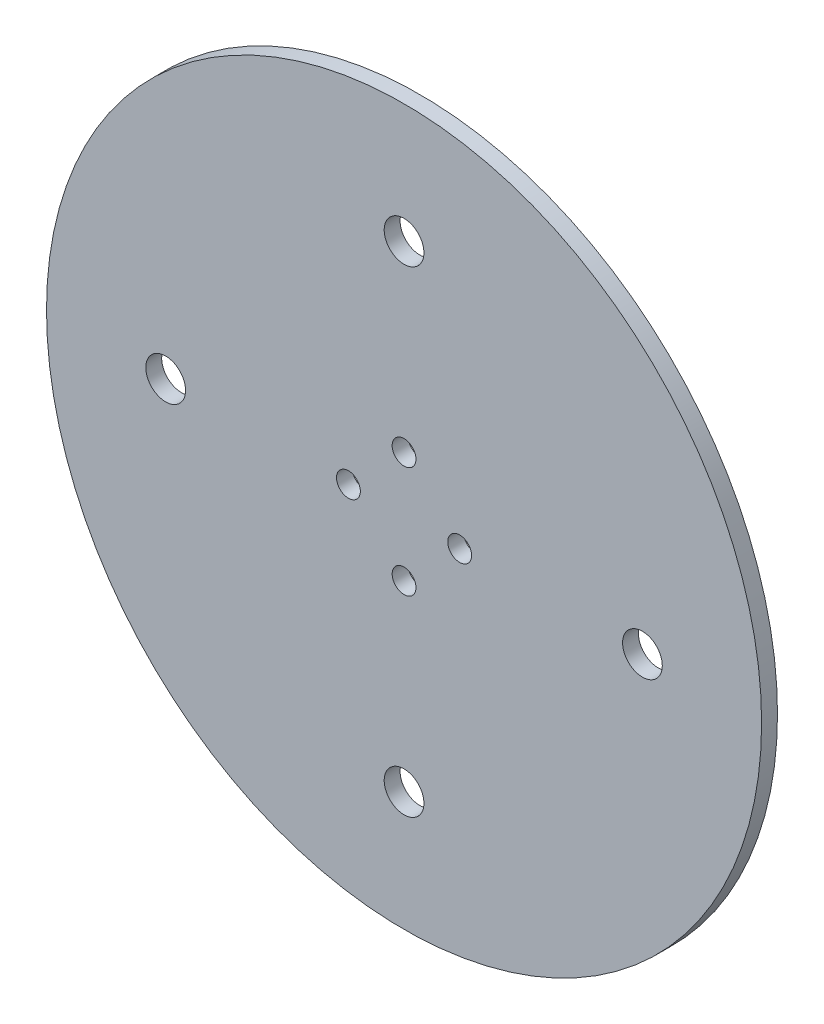
ISO-10303-21;
HEADER;
FILE_DESCRIPTION(('STEP AP214'),'2;1');
FILE_NAME('part.step','',(''),(''),'','','');
FILE_SCHEMA(('AUTOMOTIVE_DESIGN { 1 0 10303 214 1 1 1 1 }'));
ENDSEC;
DATA;
#1=APPLICATION_CONTEXT('core data for automotive mechanical design processes');
#2=APPLICATION_PROTOCOL_DEFINITION('international standard','automotive_design',2000,#1);
#3=PRODUCT_CONTEXT('',#1,'mechanical');
#4=PRODUCT('Part','Part','',(#3));
#5=PRODUCT_RELATED_PRODUCT_CATEGORY('part','',(#4));
#6=PRODUCT_DEFINITION_FORMATION('','',#4);
#7=PRODUCT_DEFINITION_CONTEXT('part definition',#1,'design');
#8=PRODUCT_DEFINITION('design','',#6,#7);
#9=PRODUCT_DEFINITION_SHAPE('','',#8);
#10=(LENGTH_UNIT() NAMED_UNIT(*) SI_UNIT(.MILLI.,.METRE.));
#11=(NAMED_UNIT(*) PLANE_ANGLE_UNIT() SI_UNIT($,.RADIAN.));
#12=(NAMED_UNIT(*) SI_UNIT($,.STERADIAN.) SOLID_ANGLE_UNIT());
#13=UNCERTAINTY_MEASURE_WITH_UNIT(LENGTH_MEASURE(1.E-05),#10,'distance_accuracy_value','');
#14=(GEOMETRIC_REPRESENTATION_CONTEXT(3) GLOBAL_UNCERTAINTY_ASSIGNED_CONTEXT((#13)) GLOBAL_UNIT_ASSIGNED_CONTEXT((#10,
#11,#12)) REPRESENTATION_CONTEXT('',''));
#15=CARTESIAN_POINT('',(0.,0.,0.));
#16=DIRECTION('',(0.,0.,1.));
#17=DIRECTION('',(1.,0.,0.));
#18=AXIS2_PLACEMENT_3D('',#15,#16,#17);
#19=CARTESIAN_POINT('',(0.,0.,2.));
#20=DIRECTION('',(0.,0.,1.));
#21=DIRECTION('',(1.,0.,0.));
#22=AXIS2_PLACEMENT_3D('',#19,#20,#21);
#23=PLANE('',#22);
#24=CARTESIAN_POINT('',(1.69795468502936E-12,-30.,2.));
#25=DIRECTION('',(0.,0.,1.));
#26=DIRECTION('',(1.,0.,0.));
#27=AXIS2_PLACEMENT_3D('',#24,#25,#26);
#28=CIRCLE('',#27,2.50000000000182);
#29=CARTESIAN_POINT('',(2.50000000000352,-30.,2.));
#30=VERTEX_POINT('',#29);
#31=EDGE_CURVE('E76',#30,#30,#28,.T.);
#32=ORIENTED_EDGE('',*,*,#31,.F.);
#33=EDGE_LOOP('',(#32));
#34=FACE_BOUND('',#33,.T.);
#35=CARTESIAN_POINT('',(-7.,0.,2.));
#36=DIRECTION('',(0.,0.,1.));
#37=DIRECTION('',(1.,0.,0.));
#38=AXIS2_PLACEMENT_3D('',#35,#36,#37);
#39=CIRCLE('',#38,1.5);
#40=CARTESIAN_POINT('',(-5.5,0.,2.));
#41=VERTEX_POINT('',#40);
#42=EDGE_CURVE('E64',#41,#41,#39,.T.);
#43=ORIENTED_EDGE('',*,*,#42,.F.);
#44=EDGE_LOOP('',(#43));
#45=FACE_BOUND('',#44,.T.);
#46=CARTESIAN_POINT('',(7.,0.,2.));
#47=DIRECTION('',(0.,0.,1.));
#48=DIRECTION('',(1.,0.,0.));
#49=AXIS2_PLACEMENT_3D('',#46,#47,#48);
#50=CIRCLE('',#49,1.5);
#51=CARTESIAN_POINT('',(8.5,0.,2.));
#52=VERTEX_POINT('',#51);
#53=EDGE_CURVE('E52',#52,#52,#50,.T.);
#54=ORIENTED_EDGE('',*,*,#53,.F.);
#55=EDGE_LOOP('',(#54));
#56=FACE_BOUND('',#55,.T.);
#57=CARTESIAN_POINT('',(0.,7.,2.));
#58=DIRECTION('',(0.,0.,1.));
#59=DIRECTION('',(1.,0.,0.));
#60=AXIS2_PLACEMENT_3D('',#57,#58,#59);
#61=CIRCLE('',#60,1.5);
#62=CARTESIAN_POINT('',(1.5,7.,2.));
#63=VERTEX_POINT('',#62);
#64=EDGE_CURVE('E41',#63,#63,#61,.T.);
#65=ORIENTED_EDGE('',*,*,#64,.F.);
#66=EDGE_LOOP('',(#65));
#67=FACE_BOUND('',#66,.T.);
#68=CARTESIAN_POINT('',(0.,0.,2.));
#69=DIRECTION('',(0.,0.,1.));
#70=DIRECTION('',(1.,0.,0.));
#71=AXIS2_PLACEMENT_3D('',#68,#69,#70);
#72=CIRCLE('',#71,45.);
#73=CARTESIAN_POINT('',(45.,0.,2.));
#74=VERTEX_POINT('',#73);
#75=EDGE_CURVE('E10',#74,#74,#72,.T.);
#76=ORIENTED_EDGE('',*,*,#75,.T.);
#77=EDGE_LOOP('',(#76));
#78=FACE_BOUND('',#77,.T.);
#79=CARTESIAN_POINT('',(0.,30.,2.));
#80=DIRECTION('',(0.,0.,1.));
#81=DIRECTION('',(1.,0.,0.));
#82=AXIS2_PLACEMENT_3D('',#79,#80,#81);
#83=CIRCLE('',#82,2.5);
#84=CARTESIAN_POINT('',(2.5,30.,2.));
#85=VERTEX_POINT('',#84);
#86=EDGE_CURVE('E46',#85,#85,#83,.T.);
#87=ORIENTED_EDGE('',*,*,#86,.F.);
#88=EDGE_LOOP('',(#87));
#89=FACE_BOUND('',#88,.T.);
#90=CARTESIAN_POINT('',(0.,-7.,2.));
#91=DIRECTION('',(0.,0.,1.));
#92=DIRECTION('',(1.,0.,0.));
#93=AXIS2_PLACEMENT_3D('',#90,#91,#92);
#94=CIRCLE('',#93,1.5);
#95=CARTESIAN_POINT('',(1.49999999999995,-7.,2.));
#96=VERTEX_POINT('',#95);
#97=EDGE_CURVE('E58',#96,#96,#94,.T.);
#98=ORIENTED_EDGE('',*,*,#97,.F.);
#99=EDGE_LOOP('',(#98));
#100=FACE_BOUND('',#99,.T.);
#101=CARTESIAN_POINT('',(30.0000000000008,8.48977342514678E-13,2.));
#102=DIRECTION('',(0.,0.,1.));
#103=DIRECTION('',(1.,0.,0.));
#104=AXIS2_PLACEMENT_3D('',#101,#102,#103);
#105=CIRCLE('',#104,2.50000000000066);
#106=CARTESIAN_POINT('',(32.5000000000015,8.48977342514678E-13,2.));
#107=VERTEX_POINT('',#106);
#108=EDGE_CURVE('E70',#107,#107,#105,.T.);
#109=ORIENTED_EDGE('',*,*,#108,.F.);
#110=EDGE_LOOP('',(#109));
#111=FACE_BOUND('',#110,.T.);
#112=CARTESIAN_POINT('',(-29.9999999999992,-8.5265128291212E-13,2.));
#113=DIRECTION('',(0.,0.,1.));
#114=DIRECTION('',(1.,0.,0.));
#115=AXIS2_PLACEMENT_3D('',#112,#113,#114);
#116=CIRCLE('',#115,2.50000000000136);
#117=CARTESIAN_POINT('',(-27.4999999999978,-8.5265128291212E-13,2.));
#118=VERTEX_POINT('',#117);
#119=EDGE_CURVE('E82',#118,#118,#116,.T.);
#120=ORIENTED_EDGE('',*,*,#119,.F.);
#121=EDGE_LOOP('',(#120));
#122=FACE_BOUND('',#121,.T.);
#123=ADVANCED_FACE('F30',(#34,#45,#56,#67,#78,#89,#100,#111,#122),#23,.T.);
#124=CARTESIAN_POINT('',(0.,0.,0.));
#125=DIRECTION('',(0.,0.,1.));
#126=DIRECTION('',(1.,0.,0.));
#127=AXIS2_PLACEMENT_3D('',#124,#125,#126);
#128=PLANE('',#127);
#129=CARTESIAN_POINT('',(0.,0.,0.));
#130=DIRECTION('',(0.,0.,1.));
#131=DIRECTION('',(1.,0.,0.));
#132=AXIS2_PLACEMENT_3D('',#129,#130,#131);
#133=CIRCLE('',#132,45.);
#134=CARTESIAN_POINT('',(45.,0.,0.));
#135=VERTEX_POINT('',#134);
#136=EDGE_CURVE('E34',#135,#135,#133,.T.);
#137=ORIENTED_EDGE('',*,*,#136,.F.);
#138=EDGE_LOOP('',(#137));
#139=FACE_BOUND('',#138,.T.);
#140=CARTESIAN_POINT('',(0.,7.,0.));
#141=DIRECTION('',(0.,0.,1.));
#142=DIRECTION('',(1.,0.,0.));
#143=AXIS2_PLACEMENT_3D('',#140,#141,#142);
#144=CIRCLE('',#143,1.5);
#145=CARTESIAN_POINT('',(1.5,7.,0.));
#146=VERTEX_POINT('',#145);
#147=EDGE_CURVE('E43',#146,#146,#144,.T.);
#148=ORIENTED_EDGE('',*,*,#147,.T.);
#149=EDGE_LOOP('',(#148));
#150=FACE_BOUND('',#149,.T.);
#151=CARTESIAN_POINT('',(0.,30.,0.));
#152=DIRECTION('',(0.,0.,1.));
#153=DIRECTION('',(1.,0.,0.));
#154=AXIS2_PLACEMENT_3D('',#151,#152,#153);
#155=CIRCLE('',#154,2.5);
#156=CARTESIAN_POINT('',(2.5,30.,0.));
#157=VERTEX_POINT('',#156);
#158=EDGE_CURVE('E49',#157,#157,#155,.T.);
#159=ORIENTED_EDGE('',*,*,#158,.T.);
#160=EDGE_LOOP('',(#159));
#161=FACE_BOUND('',#160,.T.);
#162=CARTESIAN_POINT('',(7.,0.,0.));
#163=DIRECTION('',(0.,0.,1.));
#164=DIRECTION('',(1.,0.,0.));
#165=AXIS2_PLACEMENT_3D('',#162,#163,#164);
#166=CIRCLE('',#165,1.5);
#167=CARTESIAN_POINT('',(8.5,0.,0.));
#168=VERTEX_POINT('',#167);
#169=EDGE_CURVE('E55',#168,#168,#166,.T.);
#170=ORIENTED_EDGE('',*,*,#169,.T.);
#171=EDGE_LOOP('',(#170));
#172=FACE_BOUND('',#171,.T.);
#173=CARTESIAN_POINT('',(0.,-7.,0.));
#174=DIRECTION('',(0.,0.,1.));
#175=DIRECTION('',(1.,0.,0.));
#176=AXIS2_PLACEMENT_3D('',#173,#174,#175);
#177=CIRCLE('',#176,1.5);
#178=CARTESIAN_POINT('',(1.49999999999995,-7.,0.));
#179=VERTEX_POINT('',#178);
#180=EDGE_CURVE('E61',#179,#179,#177,.T.);
#181=ORIENTED_EDGE('',*,*,#180,.T.);
#182=EDGE_LOOP('',(#181));
#183=FACE_BOUND('',#182,.T.);
#184=CARTESIAN_POINT('',(-7.,0.,0.));
#185=DIRECTION('',(0.,0.,1.));
#186=DIRECTION('',(1.,0.,0.));
#187=AXIS2_PLACEMENT_3D('',#184,#185,#186);
#188=CIRCLE('',#187,1.5);
#189=CARTESIAN_POINT('',(-5.5,0.,0.));
#190=VERTEX_POINT('',#189);
#191=EDGE_CURVE('E67',#190,#190,#188,.T.);
#192=ORIENTED_EDGE('',*,*,#191,.T.);
#193=EDGE_LOOP('',(#192));
#194=FACE_BOUND('',#193,.T.);
#195=CARTESIAN_POINT('',(30.0000000000008,8.48977342514678E-13,0.));
#196=DIRECTION('',(0.,0.,1.));
#197=DIRECTION('',(1.,0.,0.));
#198=AXIS2_PLACEMENT_3D('',#195,#196,#197);
#199=CIRCLE('',#198,2.50000000000066);
#200=CARTESIAN_POINT('',(32.5000000000015,8.48977342514678E-13,0.));
#201=VERTEX_POINT('',#200);
#202=EDGE_CURVE('E73',#201,#201,#199,.T.);
#203=ORIENTED_EDGE('',*,*,#202,.T.);
#204=EDGE_LOOP('',(#203));
#205=FACE_BOUND('',#204,.T.);
#206=CARTESIAN_POINT('',(1.69795468502936E-12,-30.,0.));
#207=DIRECTION('',(0.,0.,1.));
#208=DIRECTION('',(1.,0.,0.));
#209=AXIS2_PLACEMENT_3D('',#206,#207,#208);
#210=CIRCLE('',#209,2.50000000000182);
#211=CARTESIAN_POINT('',(2.50000000000352,-30.,0.));
#212=VERTEX_POINT('',#211);
#213=EDGE_CURVE('E79',#212,#212,#210,.T.);
#214=ORIENTED_EDGE('',*,*,#213,.T.);
#215=EDGE_LOOP('',(#214));
#216=FACE_BOUND('',#215,.T.);
#217=CARTESIAN_POINT('',(-29.9999999999992,-8.5265128291212E-13,0.));
#218=DIRECTION('',(0.,0.,1.));
#219=DIRECTION('',(1.,0.,0.));
#220=AXIS2_PLACEMENT_3D('',#217,#218,#219);
#221=CIRCLE('',#220,2.50000000000136);
#222=CARTESIAN_POINT('',(-27.4999999999978,-8.5265128291212E-13,0.));
#223=VERTEX_POINT('',#222);
#224=EDGE_CURVE('E85',#223,#223,#221,.T.);
#225=ORIENTED_EDGE('',*,*,#224,.T.);
#226=EDGE_LOOP('',(#225));
#227=FACE_BOUND('',#226,.T.);
#228=ADVANCED_FACE('F95',(#139,#150,#161,#172,#183,#194,#205,#216,#227),#128,.F.);
#229=CARTESIAN_POINT('',(0.,0.,2.));
#230=DIRECTION('',(0.,0.,-1.));
#231=DIRECTION('',(-1.,0.,0.));
#232=AXIS2_PLACEMENT_3D('',#229,#230,#231);
#233=CYLINDRICAL_SURFACE('',#232,45.);
#234=ORIENTED_EDGE('',*,*,#75,.F.);
#235=EDGE_LOOP('',(#234));
#236=FACE_BOUND('',#235,.T.);
#237=ORIENTED_EDGE('',*,*,#136,.T.);
#238=EDGE_LOOP('',(#237));
#239=FACE_BOUND('',#238,.T.);
#240=ADVANCED_FACE('F32',(#236,#239),#233,.T.);
#241=CARTESIAN_POINT('',(0.,7.,2.));
#242=DIRECTION('',(0.,0.,-1.));
#243=DIRECTION('',(-1.,0.,0.));
#244=AXIS2_PLACEMENT_3D('',#241,#242,#243);
#245=CYLINDRICAL_SURFACE('',#244,1.5);
#246=ORIENTED_EDGE('',*,*,#64,.T.);
#247=EDGE_LOOP('',(#246));
#248=FACE_BOUND('',#247,.T.);
#249=ORIENTED_EDGE('',*,*,#147,.F.);
#250=EDGE_LOOP('',(#249));
#251=FACE_BOUND('',#250,.T.);
#252=ADVANCED_FACE('F105',(#248,#251),#245,.F.);
#253=CARTESIAN_POINT('',(0.,30.,2.));
#254=DIRECTION('',(0.,0.,-1.));
#255=DIRECTION('',(-1.,0.,0.));
#256=AXIS2_PLACEMENT_3D('',#253,#254,#255);
#257=CYLINDRICAL_SURFACE('',#256,2.5);
#258=ORIENTED_EDGE('',*,*,#86,.T.);
#259=EDGE_LOOP('',(#258));
#260=FACE_BOUND('',#259,.T.);
#261=ORIENTED_EDGE('',*,*,#158,.F.);
#262=EDGE_LOOP('',(#261));
#263=FACE_BOUND('',#262,.T.);
#264=ADVANCED_FACE('F108',(#260,#263),#257,.F.);
#265=CARTESIAN_POINT('',(7.,0.,2.));
#266=DIRECTION('',(0.,0.,-1.));
#267=DIRECTION('',(-1.,0.,0.));
#268=AXIS2_PLACEMENT_3D('',#265,#266,#267);
#269=CYLINDRICAL_SURFACE('',#268,1.5);
#270=ORIENTED_EDGE('',*,*,#53,.T.);
#271=EDGE_LOOP('',(#270));
#272=FACE_BOUND('',#271,.T.);
#273=ORIENTED_EDGE('',*,*,#169,.F.);
#274=EDGE_LOOP('',(#273));
#275=FACE_BOUND('',#274,.T.);
#276=ADVANCED_FACE('F112',(#272,#275),#269,.F.);
#277=CARTESIAN_POINT('',(0.,-7.,2.));
#278=DIRECTION('',(0.,0.,-1.));
#279=DIRECTION('',(-1.,0.,0.));
#280=AXIS2_PLACEMENT_3D('',#277,#278,#279);
#281=CYLINDRICAL_SURFACE('',#280,1.5);
#282=ORIENTED_EDGE('',*,*,#97,.T.);
#283=EDGE_LOOP('',(#282));
#284=FACE_BOUND('',#283,.T.);
#285=ORIENTED_EDGE('',*,*,#180,.F.);
#286=EDGE_LOOP('',(#285));
#287=FACE_BOUND('',#286,.T.);
#288=ADVANCED_FACE('F116',(#284,#287),#281,.F.);
#289=CARTESIAN_POINT('',(-7.,0.,2.));
#290=DIRECTION('',(0.,0.,-1.));
#291=DIRECTION('',(-1.,0.,0.));
#292=AXIS2_PLACEMENT_3D('',#289,#290,#291);
#293=CYLINDRICAL_SURFACE('',#292,1.5);
#294=ORIENTED_EDGE('',*,*,#42,.T.);
#295=EDGE_LOOP('',(#294));
#296=FACE_BOUND('',#295,.T.);
#297=ORIENTED_EDGE('',*,*,#191,.F.);
#298=EDGE_LOOP('',(#297));
#299=FACE_BOUND('',#298,.T.);
#300=ADVANCED_FACE('F120',(#296,#299),#293,.F.);
#301=CARTESIAN_POINT('',(30.0000000000008,8.48977342514678E-13,2.));
#302=DIRECTION('',(0.,0.,-1.));
#303=DIRECTION('',(-1.,0.,0.));
#304=AXIS2_PLACEMENT_3D('',#301,#302,#303);
#305=CYLINDRICAL_SURFACE('',#304,2.50000000000066);
#306=ORIENTED_EDGE('',*,*,#108,.T.);
#307=EDGE_LOOP('',(#306));
#308=FACE_BOUND('',#307,.T.);
#309=ORIENTED_EDGE('',*,*,#202,.F.);
#310=EDGE_LOOP('',(#309));
#311=FACE_BOUND('',#310,.T.);
#312=ADVANCED_FACE('F124',(#308,#311),#305,.F.);
#313=CARTESIAN_POINT('',(1.69795468502936E-12,-30.,2.));
#314=DIRECTION('',(0.,0.,-1.));
#315=DIRECTION('',(-1.,0.,0.));
#316=AXIS2_PLACEMENT_3D('',#313,#314,#315);
#317=CYLINDRICAL_SURFACE('',#316,2.50000000000182);
#318=ORIENTED_EDGE('',*,*,#31,.T.);
#319=EDGE_LOOP('',(#318));
#320=FACE_BOUND('',#319,.T.);
#321=ORIENTED_EDGE('',*,*,#213,.F.);
#322=EDGE_LOOP('',(#321));
#323=FACE_BOUND('',#322,.T.);
#324=ADVANCED_FACE('F128',(#320,#323),#317,.F.);
#325=CARTESIAN_POINT('',(-29.9999999999992,-8.5265128291212E-13,2.));
#326=DIRECTION('',(0.,0.,-1.));
#327=DIRECTION('',(-1.,0.,0.));
#328=AXIS2_PLACEMENT_3D('',#325,#326,#327);
#329=CYLINDRICAL_SURFACE('',#328,2.50000000000136);
#330=ORIENTED_EDGE('',*,*,#119,.T.);
#331=EDGE_LOOP('',(#330));
#332=FACE_BOUND('',#331,.T.);
#333=ORIENTED_EDGE('',*,*,#224,.F.);
#334=EDGE_LOOP('',(#333));
#335=FACE_BOUND('',#334,.T.);
#336=ADVANCED_FACE('F91',(#332,#335),#329,.F.);
#337=CLOSED_SHELL('',(#123,#228,#240,#252,#264,#276,#288,#300,#312,#324,#336));
#338=MANIFOLD_SOLID_BREP('B2',#337);
#339=ADVANCED_BREP_SHAPE_REPRESENTATION('',(#18,#338),#14);
#340=SHAPE_DEFINITION_REPRESENTATION(#9,#339);
ENDSEC;
END-ISO-10303-21;
